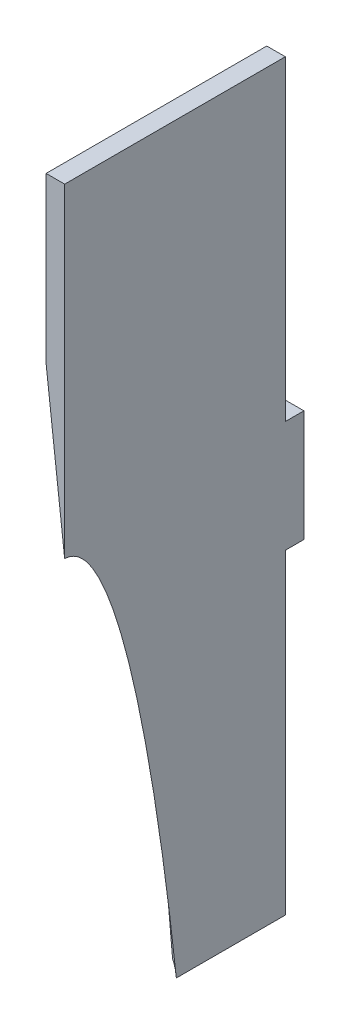
ISO-10303-21;
HEADER;
FILE_DESCRIPTION(('STEP AP214'),'2;1');
FILE_NAME('part.step','',(''),(''),'','','');
FILE_SCHEMA(('AUTOMOTIVE_DESIGN { 1 0 10303 214 1 1 1 1 }'));
ENDSEC;
DATA;
#1=APPLICATION_CONTEXT('core data for automotive mechanical design processes');
#2=APPLICATION_PROTOCOL_DEFINITION('international standard','automotive_design',2000,#1);
#3=PRODUCT_CONTEXT('',#1,'mechanical');
#4=PRODUCT('Part','Part','',(#3));
#5=PRODUCT_RELATED_PRODUCT_CATEGORY('part','',(#4));
#6=PRODUCT_DEFINITION_FORMATION('','',#4);
#7=PRODUCT_DEFINITION_CONTEXT('part definition',#1,'design');
#8=PRODUCT_DEFINITION('design','',#6,#7);
#9=PRODUCT_DEFINITION_SHAPE('','',#8);
#10=(LENGTH_UNIT() NAMED_UNIT(*) SI_UNIT(.MILLI.,.METRE.));
#11=(NAMED_UNIT(*) PLANE_ANGLE_UNIT() SI_UNIT($,.RADIAN.));
#12=(NAMED_UNIT(*) SI_UNIT($,.STERADIAN.) SOLID_ANGLE_UNIT());
#13=UNCERTAINTY_MEASURE_WITH_UNIT(LENGTH_MEASURE(1.E-05),#10,'distance_accuracy_value','');
#14=(GEOMETRIC_REPRESENTATION_CONTEXT(3) GLOBAL_UNCERTAINTY_ASSIGNED_CONTEXT((#13)) GLOBAL_UNIT_ASSIGNED_CONTEXT((#10,
#11,#12)) REPRESENTATION_CONTEXT('',''));
#15=CARTESIAN_POINT('',(0.,0.,0.));
#16=DIRECTION('',(0.,0.,1.));
#17=DIRECTION('',(1.,0.,0.));
#18=AXIS2_PLACEMENT_3D('',#15,#16,#17);
#19=CARTESIAN_POINT('',(0.,31.75,6.14934));
#20=DIRECTION('',(0.,0.,1.));
#21=DIRECTION('',(0.,-1.,0.));
#22=AXIS2_PLACEMENT_3D('',#19,#20,#21);
#23=PLANE('',#22);
#24=DIRECTION('',(0.,-1.,0.));
#25=VECTOR('',#24,1.);
#26=CARTESIAN_POINT('',(0.,31.75,6.14934));
#27=LINE('',#26,#25);
#28=CARTESIAN_POINT('',(0.,31.75,6.14934));
#29=VERTEX_POINT('',#28);
#30=CARTESIAN_POINT('',(0.,17.687069296842,6.14934000000017));
#31=VERTEX_POINT('',#30);
#32=EDGE_CURVE('E215',#29,#31,#27,.T.);
#33=ORIENTED_EDGE('',*,*,#32,.T.);
#34=DIRECTION('',(-0.115500858174568,0.993307380301253,0.));
#35=VECTOR('',#34,1.);
#36=CARTESIAN_POINT('',(20.3402561136403,-157.239133280458,6.14933999999998));
#37=LINE('',#36,#35);
#38=CARTESIAN_POINT('',(1.58749999999965,4.03456929684853,6.14934000000007));
#39=VERTEX_POINT('',#38);
#40=EDGE_CURVE('E207',#31,#39,#37,.F.);
#41=ORIENTED_EDGE('',*,*,#40,.T.);
#42=DIRECTION('',(0.,-1.,0.));
#43=VECTOR('',#42,1.);
#44=CARTESIAN_POINT('',(1.5875,31.75,6.14934));
#45=LINE('',#44,#43);
#46=CARTESIAN_POINT('',(1.5875,31.75,6.14934));
#47=VERTEX_POINT('',#46);
#48=EDGE_CURVE('E143',#47,#39,#45,.T.);
#49=ORIENTED_EDGE('',*,*,#48,.F.);
#50=DIRECTION('',(1.,0.,0.));
#51=VECTOR('',#50,1.);
#52=CARTESIAN_POINT('',(0.,31.75,6.14934));
#53=LINE('',#52,#51);
#54=EDGE_CURVE('E255',#29,#47,#53,.T.);
#55=ORIENTED_EDGE('',*,*,#54,.F.);
#56=EDGE_LOOP('',(#33,#41,#49,#55));
#57=FACE_BOUND('',#56,.T.);
#58=ADVANCED_FACE('F139',(#57),#23,.T.);
#59=CARTESIAN_POINT('',(1.5875,0.,0.));
#60=DIRECTION('',(-1.,0.,0.));
#61=DIRECTION('',(0.,0.,1.));
#62=AXIS2_PLACEMENT_3D('',#59,#60,#61);
#63=PLANE('',#62);
#64=CARTESIAN_POINT('',(1.5875,-109.219999999998,6.15052885333517));
#65=DIRECTION('',(-1.,0.,0.));
#66=DIRECTION('',(0.,1.,0.));
#67=AXIS2_PLACEMENT_3D('',#64,#65,#66);
#68=ELLIPSE('',#67,113.254569764576,13.081);
#69=CARTESIAN_POINT('',(1.5875,-31.75,-3.39140569066832));
#70=VERTEX_POINT('',#69);
#71=EDGE_CURVE('E12',#70,#39,#68,.F.);
#72=ORIENTED_EDGE('',*,*,#71,.F.);
#73=DIRECTION('',(0.,0.,-1.));
#74=VECTOR('',#73,1.);
#75=CARTESIAN_POINT('',(1.5875,-31.75,12.7));
#76=LINE('',#75,#74);
#77=CARTESIAN_POINT('',(1.5875,-31.75,-12.7));
#78=VERTEX_POINT('',#77);
#79=EDGE_CURVE('E216',#70,#78,#76,.T.);
#80=ORIENTED_EDGE('',*,*,#79,.T.);
#81=DIRECTION('',(0.,1.,0.));
#82=VECTOR('',#81,1.);
#83=CARTESIAN_POINT('',(1.5875,-31.75,-12.7));
#84=LINE('',#83,#82);
#85=CARTESIAN_POINT('',(1.5875,-4.7625,-12.7));
#86=VERTEX_POINT('',#85);
#87=EDGE_CURVE('E227',#78,#86,#84,.T.);
#88=ORIENTED_EDGE('',*,*,#87,.T.);
#89=DIRECTION('',(0.,0.,-1.));
#90=VECTOR('',#89,1.);
#91=CARTESIAN_POINT('',(1.5875,-4.7625,-12.7));
#92=LINE('',#91,#90);
#93=CARTESIAN_POINT('',(1.5875,-4.7625,-14.2875));
#94=VERTEX_POINT('',#93);
#95=EDGE_CURVE('E225',#86,#94,#92,.T.);
#96=ORIENTED_EDGE('',*,*,#95,.T.);
#97=DIRECTION('',(0.,-1.,0.));
#98=VECTOR('',#97,1.);
#99=CARTESIAN_POINT('',(1.5875,4.7625,-14.2875));
#100=LINE('',#99,#98);
#101=CARTESIAN_POINT('',(1.5875,4.7625,-14.2875));
#102=VERTEX_POINT('',#101);
#103=EDGE_CURVE('E240',#102,#94,#100,.T.);
#104=ORIENTED_EDGE('',*,*,#103,.F.);
#105=DIRECTION('',(0.,0.,-1.));
#106=VECTOR('',#105,1.);
#107=CARTESIAN_POINT('',(1.5875,4.7625,-12.7));
#108=LINE('',#107,#106);
#109=CARTESIAN_POINT('',(1.5875,4.7625,-12.7));
#110=VERTEX_POINT('',#109);
#111=EDGE_CURVE('E235',#110,#102,#108,.T.);
#112=ORIENTED_EDGE('',*,*,#111,.F.);
#113=CARTESIAN_POINT('',(1.5875,31.75,-12.7));
#114=VERTEX_POINT('',#113);
#115=EDGE_CURVE('E223',#110,#114,#84,.T.);
#116=ORIENTED_EDGE('',*,*,#115,.T.);
#117=DIRECTION('',(0.,0.,1.));
#118=VECTOR('',#117,1.);
#119=CARTESIAN_POINT('',(1.5875,31.75,12.7));
#120=LINE('',#119,#118);
#121=EDGE_CURVE('E220',#114,#47,#120,.T.);
#122=ORIENTED_EDGE('',*,*,#121,.T.);
#123=ORIENTED_EDGE('',*,*,#48,.T.);
#124=EDGE_LOOP('',(#72,#80,#88,#96,#104,#112,#116,#122,#123));
#125=FACE_BOUND('',#124,.T.);
#126=ADVANCED_FACE('F141',(#125),#63,.F.);
#127=CARTESIAN_POINT('',(0.,0.,0.));
#128=DIRECTION('',(-1.,0.,0.));
#129=DIRECTION('',(0.,0.,1.));
#130=AXIS2_PLACEMENT_3D('',#127,#128,#129);
#131=PLANE('',#130);
#132=DIRECTION('',(0.,0.,-1.));
#133=VECTOR('',#132,1.);
#134=CARTESIAN_POINT('',(0.,-31.75,12.7));
#135=LINE('',#134,#133);
#136=CARTESIAN_POINT('',(0.,-31.75,-4.65600961017686));
#137=VERTEX_POINT('',#136);
#138=CARTESIAN_POINT('',(0.,-31.75,-12.7));
#139=VERTEX_POINT('',#138);
#140=EDGE_CURVE('E262',#137,#139,#135,.T.);
#141=ORIENTED_EDGE('',*,*,#140,.F.);
#142=CARTESIAN_POINT('',(0.,-95.567499999998,6.15052885333518));
#143=DIRECTION('',(-1.,0.,0.));
#144=DIRECTION('',(0.,1.,0.));
#145=AXIS2_PLACEMENT_3D('',#142,#143,#144);
#146=ELLIPSE('',#145,113.254569764576,13.081);
#147=EDGE_CURVE('E156',#137,#31,#146,.F.);
#148=ORIENTED_EDGE('',*,*,#147,.T.);
#149=ORIENTED_EDGE('',*,*,#32,.F.);
#150=DIRECTION('',(0.,0.,1.));
#151=VECTOR('',#150,1.);
#152=CARTESIAN_POINT('',(0.,31.75,12.7));
#153=LINE('',#152,#151);
#154=CARTESIAN_POINT('',(0.,31.75,-12.7));
#155=VERTEX_POINT('',#154);
#156=EDGE_CURVE('E264',#155,#29,#153,.T.);
#157=ORIENTED_EDGE('',*,*,#156,.F.);
#158=DIRECTION('',(0.,1.,0.));
#159=VECTOR('',#158,1.);
#160=CARTESIAN_POINT('',(0.,-31.75,-12.7));
#161=LINE('',#160,#159);
#162=CARTESIAN_POINT('',(0.,4.7625,-12.7));
#163=VERTEX_POINT('',#162);
#164=EDGE_CURVE('E263',#163,#155,#161,.T.);
#165=ORIENTED_EDGE('',*,*,#164,.F.);
#166=DIRECTION('',(0.,0.,-1.));
#167=VECTOR('',#166,1.);
#168=CARTESIAN_POINT('',(0.,4.7625,-12.7));
#169=LINE('',#168,#167);
#170=CARTESIAN_POINT('',(0.,4.7625,-14.2875));
#171=VERTEX_POINT('',#170);
#172=EDGE_CURVE('E221',#163,#171,#169,.T.);
#173=ORIENTED_EDGE('',*,*,#172,.T.);
#174=DIRECTION('',(0.,-1.,0.));
#175=VECTOR('',#174,1.);
#176=CARTESIAN_POINT('',(0.,4.7625,-14.2875));
#177=LINE('',#176,#175);
#178=CARTESIAN_POINT('',(0.,-4.7625,-14.2875));
#179=VERTEX_POINT('',#178);
#180=EDGE_CURVE('E253',#171,#179,#177,.T.);
#181=ORIENTED_EDGE('',*,*,#180,.T.);
#182=DIRECTION('',(0.,0.,-1.));
#183=VECTOR('',#182,1.);
#184=CARTESIAN_POINT('',(0.,-4.7625,-12.7));
#185=LINE('',#184,#183);
#186=CARTESIAN_POINT('',(0.,-4.7625,-12.7));
#187=VERTEX_POINT('',#186);
#188=EDGE_CURVE('E236',#187,#179,#185,.T.);
#189=ORIENTED_EDGE('',*,*,#188,.F.);
#190=EDGE_CURVE('E229',#139,#187,#161,.T.);
#191=ORIENTED_EDGE('',*,*,#190,.F.);
#192=EDGE_LOOP('',(#141,#148,#149,#157,#165,#173,#181,#189,#191));
#193=FACE_BOUND('',#192,.T.);
#194=ADVANCED_FACE('F282',(#193),#131,.T.);
#195=CARTESIAN_POINT('',(1.5875,31.75,12.7));
#196=DIRECTION('',(0.,-1.,0.));
#197=DIRECTION('',(0.,0.,-1.));
#198=AXIS2_PLACEMENT_3D('',#195,#196,#197);
#199=PLANE('',#198);
#200=ORIENTED_EDGE('',*,*,#54,.T.);
#201=ORIENTED_EDGE('',*,*,#121,.F.);
#202=DIRECTION('',(-1.,0.,0.));
#203=VECTOR('',#202,1.);
#204=CARTESIAN_POINT('',(1.5875,31.75,-12.7));
#205=LINE('',#204,#203);
#206=EDGE_CURVE('E259',#114,#155,#205,.T.);
#207=ORIENTED_EDGE('',*,*,#206,.T.);
#208=ORIENTED_EDGE('',*,*,#156,.T.);
#209=EDGE_LOOP('',(#200,#201,#207,#208));
#210=FACE_BOUND('',#209,.T.);
#211=ADVANCED_FACE('F291',(#210),#199,.F.);
#212=CARTESIAN_POINT('',(1.5875,-31.75,12.7));
#213=DIRECTION('',(0.,1.,0.));
#214=DIRECTION('',(0.,0.,1.));
#215=AXIS2_PLACEMENT_3D('',#212,#213,#214);
#216=PLANE('',#215);
#217=CARTESIAN_POINT('',(-7.42063953488375,-31.75,6.15052885333525));
#218=DIRECTION('',(0.,1.,0.));
#219=DIRECTION('',(-1.,0.,0.));
#220=AXIS2_PLACEMENT_3D('',#217,#218,#219);
#221=ELLIPSE('',#220,13.1691360191372,13.081);
#222=EDGE_CURVE('E149',#137,#70,#221,.F.);
#223=ORIENTED_EDGE('',*,*,#222,.F.);
#224=ORIENTED_EDGE('',*,*,#140,.T.);
#225=DIRECTION('',(-1.,0.,0.));
#226=VECTOR('',#225,1.);
#227=CARTESIAN_POINT('',(1.5875,-31.75,-12.7));
#228=LINE('',#227,#226);
#229=EDGE_CURVE('E246',#78,#139,#228,.T.);
#230=ORIENTED_EDGE('',*,*,#229,.F.);
#231=ORIENTED_EDGE('',*,*,#79,.F.);
#232=EDGE_LOOP('',(#223,#224,#230,#231));
#233=FACE_BOUND('',#232,.T.);
#234=ADVANCED_FACE('F288',(#233),#216,.F.);
#235=CARTESIAN_POINT('',(1.5875,-31.75,-12.7));
#236=DIRECTION('',(0.,0.,1.));
#237=DIRECTION('',(1.,0.,0.));
#238=AXIS2_PLACEMENT_3D('',#235,#236,#237);
#239=PLANE('',#238);
#240=DIRECTION('',(1.,0.,0.));
#241=VECTOR('',#240,1.);
#242=CARTESIAN_POINT('',(0.,4.7625,-12.7));
#243=LINE('',#242,#241);
#244=EDGE_CURVE('E241',#163,#110,#243,.T.);
#245=ORIENTED_EDGE('',*,*,#244,.F.);
#246=ORIENTED_EDGE('',*,*,#164,.T.);
#247=ORIENTED_EDGE('',*,*,#206,.F.);
#248=ORIENTED_EDGE('',*,*,#115,.F.);
#249=EDGE_LOOP('',(#245,#246,#247,#248));
#250=FACE_BOUND('',#249,.T.);
#251=ADVANCED_FACE('F290',(#250),#239,.F.);
#252=ORIENTED_EDGE('',*,*,#190,.T.);
#253=DIRECTION('',(1.,0.,0.));
#254=VECTOR('',#253,1.);
#255=CARTESIAN_POINT('',(0.,-4.7625,-12.7));
#256=LINE('',#255,#254);
#257=EDGE_CURVE('E243',#187,#86,#256,.T.);
#258=ORIENTED_EDGE('',*,*,#257,.T.);
#259=ORIENTED_EDGE('',*,*,#87,.F.);
#260=ORIENTED_EDGE('',*,*,#229,.T.);
#261=EDGE_LOOP('',(#252,#258,#259,#260));
#262=FACE_BOUND('',#261,.T.);
#263=ADVANCED_FACE('F279',(#262),#239,.F.);
#264=CARTESIAN_POINT('',(0.,-4.7625,-12.7));
#265=DIRECTION('',(0.,-1.,0.));
#266=DIRECTION('',(0.,0.,-1.));
#267=AXIS2_PLACEMENT_3D('',#264,#265,#266);
#268=PLANE('',#267);
#269=ORIENTED_EDGE('',*,*,#95,.F.);
#270=ORIENTED_EDGE('',*,*,#257,.F.);
#271=ORIENTED_EDGE('',*,*,#188,.T.);
#272=DIRECTION('',(1.,0.,0.));
#273=VECTOR('',#272,1.);
#274=CARTESIAN_POINT('',(0.,-4.7625,-14.2875));
#275=LINE('',#274,#273);
#276=EDGE_CURVE('E233',#179,#94,#275,.T.);
#277=ORIENTED_EDGE('',*,*,#276,.T.);
#278=EDGE_LOOP('',(#269,#270,#271,#277));
#279=FACE_BOUND('',#278,.T.);
#280=ADVANCED_FACE('F286',(#279),#268,.T.);
#281=CARTESIAN_POINT('',(0.,4.7625,-12.7));
#282=DIRECTION('',(0.,-1.,0.));
#283=DIRECTION('',(0.,0.,-1.));
#284=AXIS2_PLACEMENT_3D('',#281,#282,#283);
#285=PLANE('',#284);
#286=ORIENTED_EDGE('',*,*,#111,.T.);
#287=DIRECTION('',(1.,0.,0.));
#288=VECTOR('',#287,1.);
#289=CARTESIAN_POINT('',(0.,4.7625,-14.2875));
#290=LINE('',#289,#288);
#291=EDGE_CURVE('E237',#171,#102,#290,.T.);
#292=ORIENTED_EDGE('',*,*,#291,.F.);
#293=ORIENTED_EDGE('',*,*,#172,.F.);
#294=ORIENTED_EDGE('',*,*,#244,.T.);
#295=EDGE_LOOP('',(#286,#292,#293,#294));
#296=FACE_BOUND('',#295,.T.);
#297=ADVANCED_FACE('F309',(#296),#285,.F.);
#298=CARTESIAN_POINT('',(0.,4.7625,-14.2875));
#299=DIRECTION('',(0.,0.,1.));
#300=DIRECTION('',(1.,0.,0.));
#301=AXIS2_PLACEMENT_3D('',#298,#299,#300);
#302=PLANE('',#301);
#303=ORIENTED_EDGE('',*,*,#103,.T.);
#304=ORIENTED_EDGE('',*,*,#276,.F.);
#305=ORIENTED_EDGE('',*,*,#180,.F.);
#306=ORIENTED_EDGE('',*,*,#291,.T.);
#307=EDGE_LOOP('',(#303,#304,#305,#306));
#308=FACE_BOUND('',#307,.T.);
#309=ADVANCED_FACE('F308',(#308),#302,.F.);
#310=CARTESIAN_POINT('',(7.34680232558188,-158.75,6.15052885333511));
#311=DIRECTION('',(-0.115500858174568,0.993307380301253,0.));
#312=DIRECTION('',(-0.993307380301253,-0.115500858174568,0.));
#313=AXIS2_PLACEMENT_3D('',#310,#311,#312);
#314=CYLINDRICAL_SURFACE('',#313,13.081);
#315=ORIENTED_EDGE('',*,*,#222,.T.);
#316=ORIENTED_EDGE('',*,*,#71,.T.);
#317=ORIENTED_EDGE('',*,*,#40,.F.);
#318=ORIENTED_EDGE('',*,*,#147,.F.);
#319=EDGE_LOOP('',(#315,#316,#317,#318));
#320=FACE_BOUND('',#319,.T.);
#321=ADVANCED_FACE('F206',(#320),#314,.F.);
#322=CLOSED_SHELL('',(#58,#126,#194,#211,#234,#251,#263,#280,#297,#309,#321));
#323=MANIFOLD_SOLID_BREP('B2',#322);
#324=ADVANCED_BREP_SHAPE_REPRESENTATION('',(#18,#323),#14);
#325=SHAPE_DEFINITION_REPRESENTATION(#9,#324);
ENDSEC;
END-ISO-10303-21;
